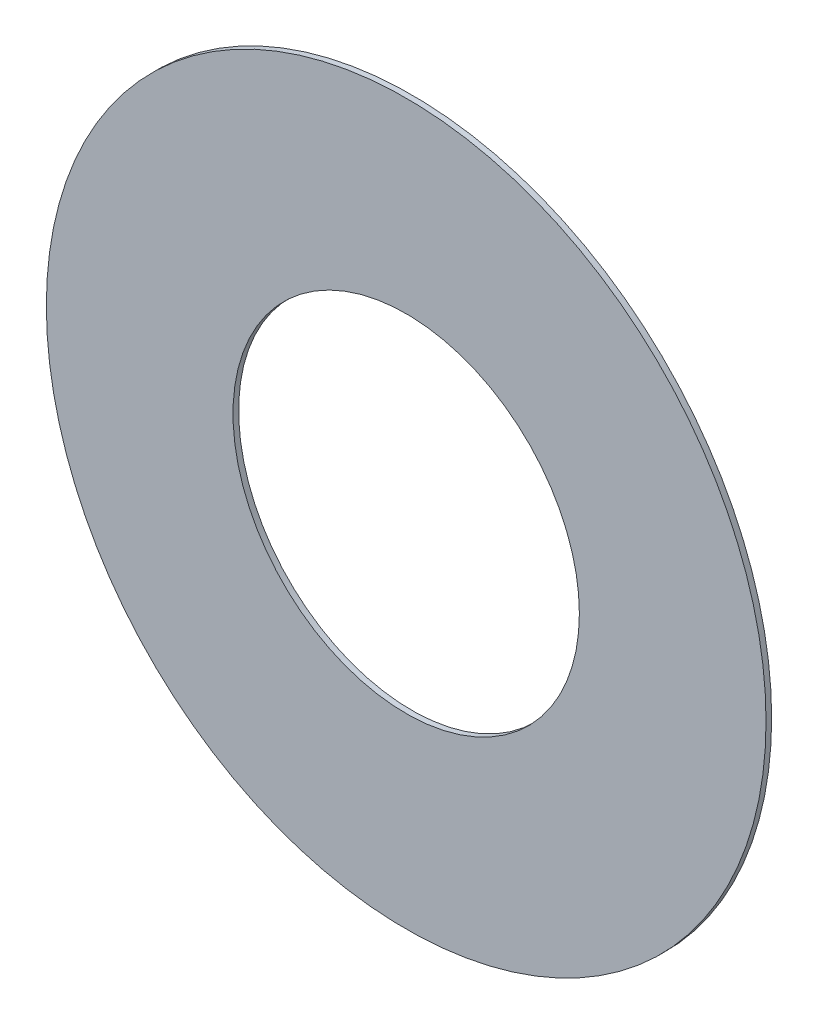
ISO-10303-21;
HEADER;
FILE_DESCRIPTION(('STEP AP214'),'2;1');
FILE_NAME('part.step','',(''),(''),'','','');
FILE_SCHEMA(('AUTOMOTIVE_DESIGN { 1 0 10303 214 1 1 1 1 }'));
ENDSEC;
DATA;
#1=APPLICATION_CONTEXT('core data for automotive mechanical design processes');
#2=APPLICATION_PROTOCOL_DEFINITION('international standard','automotive_design',2000,#1);
#3=PRODUCT_CONTEXT('',#1,'mechanical');
#4=PRODUCT('Part','Part','',(#3));
#5=PRODUCT_RELATED_PRODUCT_CATEGORY('part','',(#4));
#6=PRODUCT_DEFINITION_FORMATION('','',#4);
#7=PRODUCT_DEFINITION_CONTEXT('part definition',#1,'design');
#8=PRODUCT_DEFINITION('design','',#6,#7);
#9=PRODUCT_DEFINITION_SHAPE('','',#8);
#10=(LENGTH_UNIT() NAMED_UNIT(*) SI_UNIT(.MILLI.,.METRE.));
#11=(NAMED_UNIT(*) PLANE_ANGLE_UNIT() SI_UNIT($,.RADIAN.));
#12=(NAMED_UNIT(*) SI_UNIT($,.STERADIAN.) SOLID_ANGLE_UNIT());
#13=UNCERTAINTY_MEASURE_WITH_UNIT(LENGTH_MEASURE(1.E-05),#10,'distance_accuracy_value','');
#14=(GEOMETRIC_REPRESENTATION_CONTEXT(3) GLOBAL_UNCERTAINTY_ASSIGNED_CONTEXT((#13)) GLOBAL_UNIT_ASSIGNED_CONTEXT((#10,
#11,#12)) REPRESENTATION_CONTEXT('',''));
#15=CARTESIAN_POINT('',(0.,0.,0.));
#16=DIRECTION('',(0.,0.,1.));
#17=DIRECTION('',(1.,0.,0.));
#18=AXIS2_PLACEMENT_3D('',#15,#16,#17);
#19=CARTESIAN_POINT('',(0.,0.,0.3175));
#20=DIRECTION('',(0.,0.,1.));
#21=DIRECTION('',(1.,0.,0.));
#22=AXIS2_PLACEMENT_3D('',#19,#20,#21);
#23=PLANE('',#22);
#24=CARTESIAN_POINT('',(0.,0.,0.3175));
#25=DIRECTION('',(0.,0.,1.));
#26=DIRECTION('',(1.,0.,0.));
#27=AXIS2_PLACEMENT_3D('',#24,#25,#26);
#28=CIRCLE('',#27,20.32);
#29=CARTESIAN_POINT('',(20.32,0.,0.3175));
#30=VERTEX_POINT('',#29);
#31=EDGE_CURVE('E10',#30,#30,#28,.T.);
#32=ORIENTED_EDGE('',*,*,#31,.T.);
#33=EDGE_LOOP('',(#32));
#34=FACE_BOUND('',#33,.T.);
#35=CARTESIAN_POINT('',(0.,0.,0.3175));
#36=DIRECTION('',(0.,0.,1.));
#37=DIRECTION('',(1.,0.,0.));
#38=AXIS2_PLACEMENT_3D('',#35,#36,#37);
#39=CIRCLE('',#38,9.779);
#40=CARTESIAN_POINT('',(9.779,0.,0.3175));
#41=VERTEX_POINT('',#40);
#42=EDGE_CURVE('E55',#41,#41,#39,.T.);
#43=ORIENTED_EDGE('',*,*,#42,.F.);
#44=EDGE_LOOP('',(#43));
#45=FACE_BOUND('',#44,.T.);
#46=ADVANCED_FACE('F41',(#34,#45),#23,.T.);
#47=CARTESIAN_POINT('',(0.,0.,0.));
#48=DIRECTION('',(0.,0.,1.));
#49=DIRECTION('',(1.,0.,0.));
#50=AXIS2_PLACEMENT_3D('',#47,#48,#49);
#51=PLANE('',#50);
#52=CARTESIAN_POINT('',(0.,0.,0.));
#53=DIRECTION('',(0.,0.,1.));
#54=DIRECTION('',(1.,0.,0.));
#55=AXIS2_PLACEMENT_3D('',#52,#53,#54);
#56=CIRCLE('',#55,20.32);
#57=CARTESIAN_POINT('',(20.32,0.,0.));
#58=VERTEX_POINT('',#57);
#59=EDGE_CURVE('E45',#58,#58,#56,.T.);
#60=ORIENTED_EDGE('',*,*,#59,.F.);
#61=EDGE_LOOP('',(#60));
#62=FACE_BOUND('',#61,.T.);
#63=CARTESIAN_POINT('',(0.,0.,0.));
#64=DIRECTION('',(0.,0.,1.));
#65=DIRECTION('',(1.,0.,0.));
#66=AXIS2_PLACEMENT_3D('',#63,#64,#65);
#67=CIRCLE('',#66,9.779);
#68=CARTESIAN_POINT('',(9.779,0.,0.));
#69=VERTEX_POINT('',#68);
#70=EDGE_CURVE('E57',#69,#69,#67,.T.);
#71=ORIENTED_EDGE('',*,*,#70,.T.);
#72=EDGE_LOOP('',(#71));
#73=FACE_BOUND('',#72,.T.);
#74=ADVANCED_FACE('F70',(#62,#73),#51,.F.);
#75=CARTESIAN_POINT('',(0.,0.,0.3175));
#76=DIRECTION('',(0.,0.,-1.));
#77=DIRECTION('',(-1.,0.,0.));
#78=AXIS2_PLACEMENT_3D('',#75,#76,#77);
#79=CYLINDRICAL_SURFACE('',#78,20.32);
#80=ORIENTED_EDGE('',*,*,#31,.F.);
#81=EDGE_LOOP('',(#80));
#82=FACE_BOUND('',#81,.T.);
#83=ORIENTED_EDGE('',*,*,#59,.T.);
#84=EDGE_LOOP('',(#83));
#85=FACE_BOUND('',#84,.T.);
#86=ADVANCED_FACE('F43',(#82,#85),#79,.T.);
#87=CARTESIAN_POINT('',(0.,0.,0.3175));
#88=DIRECTION('',(0.,0.,-1.));
#89=DIRECTION('',(-1.,0.,0.));
#90=AXIS2_PLACEMENT_3D('',#87,#88,#89);
#91=CYLINDRICAL_SURFACE('',#90,9.779);
#92=ORIENTED_EDGE('',*,*,#42,.T.);
#93=EDGE_LOOP('',(#92));
#94=FACE_BOUND('',#93,.T.);
#95=ORIENTED_EDGE('',*,*,#70,.F.);
#96=EDGE_LOOP('',(#95));
#97=FACE_BOUND('',#96,.T.);
#98=ADVANCED_FACE('F66',(#94,#97),#91,.F.);
#99=CLOSED_SHELL('',(#46,#74,#86,#98));
#100=MANIFOLD_SOLID_BREP('B2',#99);
#101=ADVANCED_BREP_SHAPE_REPRESENTATION('',(#18,#100),#14);
#102=SHAPE_DEFINITION_REPRESENTATION(#9,#101);
ENDSEC;
END-ISO-10303-21;
